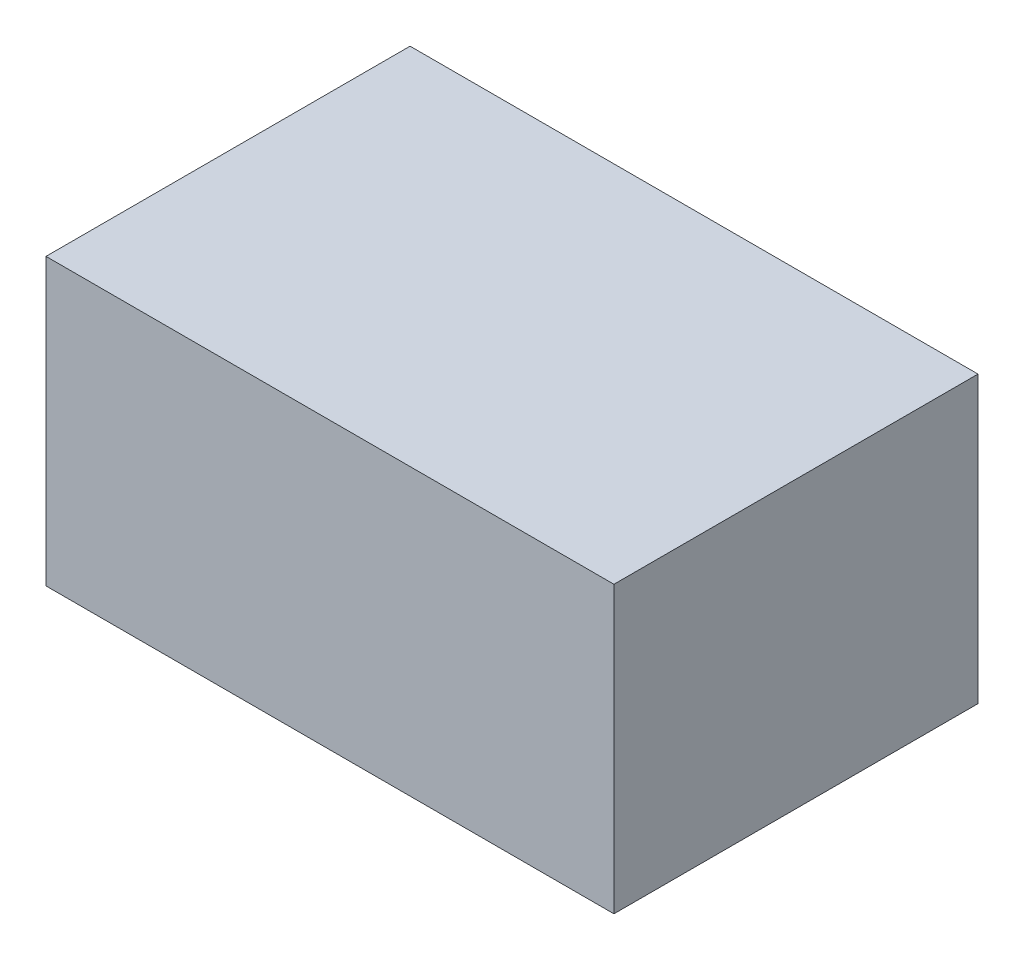
ISO-10303-21;
HEADER;
FILE_DESCRIPTION(('STEP AP214'),'2;1');
FILE_NAME('part.step','',(''),(''),'','','');
FILE_SCHEMA(('AUTOMOTIVE_DESIGN { 1 0 10303 214 1 1 1 1 }'));
ENDSEC;
DATA;
#1=APPLICATION_CONTEXT('core data for automotive mechanical design processes');
#2=APPLICATION_PROTOCOL_DEFINITION('international standard','automotive_design',2000,#1);
#3=PRODUCT_CONTEXT('',#1,'mechanical');
#4=PRODUCT('Part','Part','',(#3));
#5=PRODUCT_RELATED_PRODUCT_CATEGORY('part','',(#4));
#6=PRODUCT_DEFINITION_FORMATION('','',#4);
#7=PRODUCT_DEFINITION_CONTEXT('part definition',#1,'design');
#8=PRODUCT_DEFINITION('design','',#6,#7);
#9=PRODUCT_DEFINITION_SHAPE('','',#8);
#10=(LENGTH_UNIT() NAMED_UNIT(*) SI_UNIT(.MILLI.,.METRE.));
#11=(NAMED_UNIT(*) PLANE_ANGLE_UNIT() SI_UNIT($,.RADIAN.));
#12=(NAMED_UNIT(*) SI_UNIT($,.STERADIAN.) SOLID_ANGLE_UNIT());
#13=UNCERTAINTY_MEASURE_WITH_UNIT(LENGTH_MEASURE(1.E-05),#10,'distance_accuracy_value','');
#14=(GEOMETRIC_REPRESENTATION_CONTEXT(3) GLOBAL_UNCERTAINTY_ASSIGNED_CONTEXT((#13)) GLOBAL_UNIT_ASSIGNED_CONTEXT((#10,
#11,#12)) REPRESENTATION_CONTEXT('',''));
#15=CARTESIAN_POINT('',(0.,0.,0.));
#16=DIRECTION('',(0.,0.,1.));
#17=DIRECTION('',(1.,0.,0.));
#18=AXIS2_PLACEMENT_3D('',#15,#16,#17);
#19=CARTESIAN_POINT('',(-9.75000082,4.90000036,0.));
#20=DIRECTION('',(0.,1.,0.));
#21=DIRECTION('',(0.,0.,1.));
#22=AXIS2_PLACEMENT_3D('',#19,#20,#21);
#23=PLANE('',#22);
#24=DIRECTION('',(0.,0.,1.));
#25=VECTOR('',#24,1.);
#26=CARTESIAN_POINT('',(9.74999828,4.90000036,0.));
#27=LINE('',#26,#25);
#28=CARTESIAN_POINT('',(9.749998915,4.90000036,0.));
#29=VERTEX_POINT('',#28);
#30=CARTESIAN_POINT('',(9.749998915,4.90000036,12.5000004));
#31=VERTEX_POINT('',#30);
#32=EDGE_CURVE('E20',#29,#31,#27,.T.);
#33=ORIENTED_EDGE('',*,*,#32,.F.);
#34=DIRECTION('',(1.,0.,0.));
#35=VECTOR('',#34,1.);
#36=CARTESIAN_POINT('',(9.75000082,4.90000036,0.));
#37=LINE('',#36,#35);
#38=CARTESIAN_POINT('',(-9.74999955,4.899999725,0.));
#39=VERTEX_POINT('',#38);
#40=EDGE_CURVE('E80',#29,#39,#37,.F.);
#41=ORIENTED_EDGE('',*,*,#40,.T.);
#42=DIRECTION('',(0.,0.,1.));
#43=VECTOR('',#42,1.);
#44=CARTESIAN_POINT('',(-9.74999828,4.89999782,0.));
#45=LINE('',#44,#43);
#46=CARTESIAN_POINT('',(-9.749998915,4.899999725,12.5000004));
#47=VERTEX_POINT('',#46);
#48=EDGE_CURVE('E68',#47,#39,#45,.F.);
#49=ORIENTED_EDGE('',*,*,#48,.F.);
#50=DIRECTION('',(1.,0.,0.));
#51=VECTOR('',#50,1.);
#52=CARTESIAN_POINT('',(9.75000082,4.90000036,12.5000004));
#53=LINE('',#52,#51);
#54=EDGE_CURVE('E56',#31,#47,#53,.F.);
#55=ORIENTED_EDGE('',*,*,#54,.F.);
#56=EDGE_LOOP('',(#33,#41,#49,#55));
#57=FACE_BOUND('',#56,.T.);
#58=ADVANCED_FACE('F17',(#57),#23,.T.);
#59=CARTESIAN_POINT('',(9.74999828,4.90000036,0.));
#60=DIRECTION('',(0.999999999999966,2.59183654120991E-07,0.));
#61=DIRECTION('',(-2.59183654120991E-07,0.999999999999966,0.));
#62=AXIS2_PLACEMENT_3D('',#59,#60,#61);
#63=PLANE('',#62);
#64=DIRECTION('',(0.,0.,-1.));
#65=VECTOR('',#64,1.);
#66=CARTESIAN_POINT('',(9.75000082,-4.90000036,0.));
#67=LINE('',#66,#65);
#68=CARTESIAN_POINT('',(9.75000082,-4.90000036,0.));
#69=VERTEX_POINT('',#68);
#70=CARTESIAN_POINT('',(9.75000082,-4.90000036,12.5000004));
#71=VERTEX_POINT('',#70);
#72=EDGE_CURVE('E83',#69,#71,#67,.F.);
#73=ORIENTED_EDGE('',*,*,#72,.F.);
#74=DIRECTION('',(0.,1.,0.));
#75=VECTOR('',#74,1.);
#76=CARTESIAN_POINT('',(9.75000082,-4.90000036,0.));
#77=LINE('',#76,#75);
#78=EDGE_CURVE('E65',#69,#29,#77,.T.);
#79=ORIENTED_EDGE('',*,*,#78,.T.);
#80=ORIENTED_EDGE('',*,*,#32,.T.);
#81=DIRECTION('',(0.,1.,0.));
#82=VECTOR('',#81,1.);
#83=CARTESIAN_POINT('',(9.75000082,-4.90000036,12.5000004));
#84=LINE('',#83,#82);
#85=EDGE_CURVE('E62',#71,#31,#84,.T.);
#86=ORIENTED_EDGE('',*,*,#85,.F.);
#87=EDGE_LOOP('',(#73,#79,#80,#86));
#88=FACE_BOUND('',#87,.T.);
#89=ADVANCED_FACE('F61',(#88),#63,.T.);
#90=CARTESIAN_POINT('',(9.75000082,-4.90000036,12.5000004));
#91=DIRECTION('',(0.,0.,1.));
#92=DIRECTION('',(1.,0.,0.));
#93=AXIS2_PLACEMENT_3D('',#90,#91,#92);
#94=PLANE('',#93);
#95=DIRECTION('',(0.,1.,0.));
#96=VECTOR('',#95,1.);
#97=CARTESIAN_POINT('',(-9.74999828,-4.90000036,12.5000004));
#98=LINE('',#97,#96);
#99=CARTESIAN_POINT('',(-9.74999828,-4.90000036,12.5000004));
#100=VERTEX_POINT('',#99);
#101=EDGE_CURVE('E70',#100,#47,#98,.T.);
#102=ORIENTED_EDGE('',*,*,#101,.F.);
#103=DIRECTION('',(1.,0.,0.));
#104=VECTOR('',#103,1.);
#105=CARTESIAN_POINT('',(9.75000082,-4.90000036,12.5000004));
#106=LINE('',#105,#104);
#107=EDGE_CURVE('E74',#71,#100,#106,.F.);
#108=ORIENTED_EDGE('',*,*,#107,.F.);
#109=ORIENTED_EDGE('',*,*,#85,.T.);
#110=ORIENTED_EDGE('',*,*,#54,.T.);
#111=EDGE_LOOP('',(#102,#108,#109,#110));
#112=FACE_BOUND('',#111,.T.);
#113=ADVANCED_FACE('F72',(#112),#94,.T.);
#114=CARTESIAN_POINT('',(-9.74999828,-4.90000036,0.));
#115=DIRECTION('',(-1.,0.,0.));
#116=DIRECTION('',(0.,0.,1.));
#117=AXIS2_PLACEMENT_3D('',#114,#115,#116);
#118=PLANE('',#117);
#119=ORIENTED_EDGE('',*,*,#48,.T.);
#120=DIRECTION('',(0.,1.,0.));
#121=VECTOR('',#120,1.);
#122=CARTESIAN_POINT('',(-9.74999828,-4.90000036,0.));
#123=LINE('',#122,#121);
#124=CARTESIAN_POINT('',(-9.74999828,-4.90000036,0.));
#125=VERTEX_POINT('',#124);
#126=EDGE_CURVE('E35',#39,#125,#123,.F.);
#127=ORIENTED_EDGE('',*,*,#126,.T.);
#128=DIRECTION('',(0.,0.,-1.));
#129=VECTOR('',#128,1.);
#130=CARTESIAN_POINT('',(-9.74999828,-4.90000036,0.));
#131=LINE('',#130,#129);
#132=EDGE_CURVE('E26',#100,#125,#131,.T.);
#133=ORIENTED_EDGE('',*,*,#132,.F.);
#134=ORIENTED_EDGE('',*,*,#101,.T.);
#135=EDGE_LOOP('',(#119,#127,#133,#134));
#136=FACE_BOUND('',#135,.T.);
#137=ADVANCED_FACE('F89',(#136),#118,.T.);
#138=CARTESIAN_POINT('',(9.75000082,-4.90000036,0.));
#139=DIRECTION('',(0.,0.,1.));
#140=DIRECTION('',(1.,0.,0.));
#141=AXIS2_PLACEMENT_3D('',#138,#139,#140);
#142=PLANE('',#141);
#143=ORIENTED_EDGE('',*,*,#126,.F.);
#144=ORIENTED_EDGE('',*,*,#40,.F.);
#145=ORIENTED_EDGE('',*,*,#78,.F.);
#146=DIRECTION('',(1.,0.,0.));
#147=VECTOR('',#146,1.);
#148=CARTESIAN_POINT('',(9.75000082,-4.90000036,0.));
#149=LINE('',#148,#147);
#150=EDGE_CURVE('E11',#125,#69,#149,.T.);
#151=ORIENTED_EDGE('',*,*,#150,.F.);
#152=EDGE_LOOP('',(#143,#144,#145,#151));
#153=FACE_BOUND('',#152,.T.);
#154=ADVANCED_FACE('F91',(#153),#142,.F.);
#155=CARTESIAN_POINT('',(9.75000082,-4.90000036,0.));
#156=DIRECTION('',(0.,-1.,0.));
#157=DIRECTION('',(0.,0.,-1.));
#158=AXIS2_PLACEMENT_3D('',#155,#156,#157);
#159=PLANE('',#158);
#160=ORIENTED_EDGE('',*,*,#132,.T.);
#161=ORIENTED_EDGE('',*,*,#150,.T.);
#162=ORIENTED_EDGE('',*,*,#72,.T.);
#163=ORIENTED_EDGE('',*,*,#107,.T.);
#164=EDGE_LOOP('',(#160,#161,#162,#163));
#165=FACE_BOUND('',#164,.T.);
#166=ADVANCED_FACE('F88',(#165),#159,.T.);
#167=CLOSED_SHELL('',(#58,#89,#113,#137,#154,#166));
#168=MANIFOLD_SOLID_BREP('B1',#167);
#169=ADVANCED_BREP_SHAPE_REPRESENTATION('',(#18,#168),#14);
#170=SHAPE_DEFINITION_REPRESENTATION(#9,#169);
ENDSEC;
END-ISO-10303-21;
